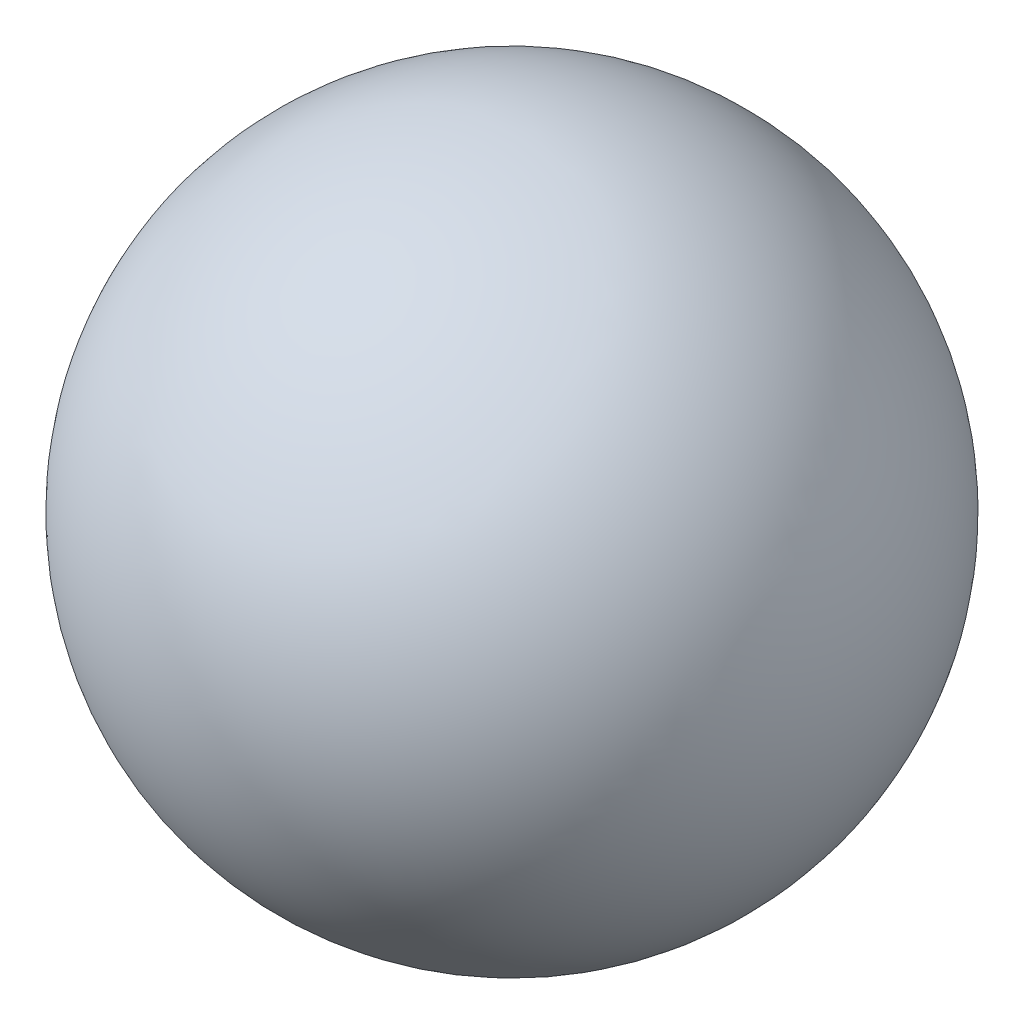
ISO-10303-21;
HEADER;
FILE_DESCRIPTION(('STEP AP214'),'2;1');
FILE_NAME('part.step','',(''),(''),'','','');
FILE_SCHEMA(('AUTOMOTIVE_DESIGN { 1 0 10303 214 1 1 1 1 }'));
ENDSEC;
DATA;
#1=APPLICATION_CONTEXT('core data for automotive mechanical design processes');
#2=APPLICATION_PROTOCOL_DEFINITION('international standard','automotive_design',2000,#1);
#3=PRODUCT_CONTEXT('',#1,'mechanical');
#4=PRODUCT('Part','Part','',(#3));
#5=PRODUCT_RELATED_PRODUCT_CATEGORY('part','',(#4));
#6=PRODUCT_DEFINITION_FORMATION('','',#4);
#7=PRODUCT_DEFINITION_CONTEXT('part definition',#1,'design');
#8=PRODUCT_DEFINITION('design','',#6,#7);
#9=PRODUCT_DEFINITION_SHAPE('','',#8);
#10=(LENGTH_UNIT() NAMED_UNIT(*) SI_UNIT(.MILLI.,.METRE.));
#11=(NAMED_UNIT(*) PLANE_ANGLE_UNIT() SI_UNIT($,.RADIAN.));
#12=(NAMED_UNIT(*) SI_UNIT($,.STERADIAN.) SOLID_ANGLE_UNIT());
#13=UNCERTAINTY_MEASURE_WITH_UNIT(LENGTH_MEASURE(1.E-05),#10,'distance_accuracy_value','');
#14=(GEOMETRIC_REPRESENTATION_CONTEXT(3) GLOBAL_UNCERTAINTY_ASSIGNED_CONTEXT((#13)) GLOBAL_UNIT_ASSIGNED_CONTEXT((#10,
#11,#12)) REPRESENTATION_CONTEXT('',''));
#15=CARTESIAN_POINT('',(0.,0.,0.));
#16=DIRECTION('',(0.,0.,1.));
#17=DIRECTION('',(1.,0.,0.));
#18=AXIS2_PLACEMENT_3D('',#15,#16,#17);
#19=CARTESIAN_POINT('',(-120.,0.,0.));
#20=DIRECTION('',(-1.,0.,0.));
#21=DIRECTION('',(0.,1.,0.));
#22=AXIS2_PLACEMENT_3D('',#19,#20,#21);
#23=SPHERICAL_SURFACE('',#22,120.);
#24=CARTESIAN_POINT('',(-240.,0.,0.));
#25=VERTEX_POINT('',#24);
#26=VERTEX_LOOP('',#25);
#27=FACE_BOUND('',#26,.T.);
#28=ADVANCED_FACE('F35',(#27),#23,.T.);
#29=CLOSED_SHELL('',(#28));
#30=MANIFOLD_SOLID_BREP('B2',#29);
#31=ADVANCED_BREP_SHAPE_REPRESENTATION('',(#18,#30),#14);
#32=SHAPE_DEFINITION_REPRESENTATION(#9,#31);
ENDSEC;
END-ISO-10303-21;
